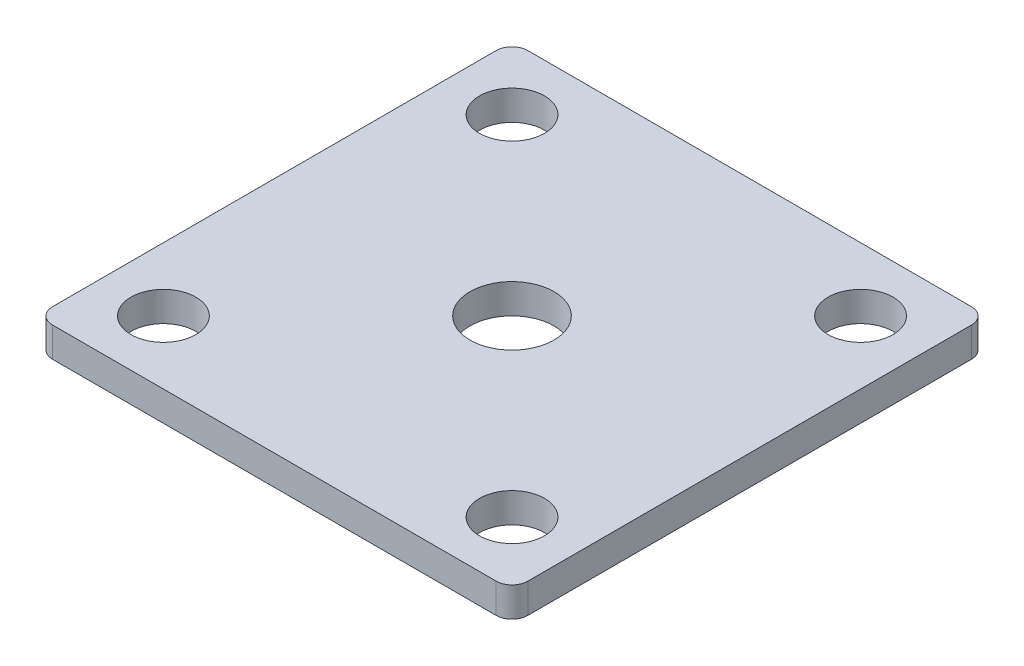
ISO-10303-21;
HEADER;
FILE_DESCRIPTION(('STEP AP214'),'2;1');
FILE_NAME('part.step','',(''),(''),'','','');
FILE_SCHEMA(('AUTOMOTIVE_DESIGN { 1 0 10303 214 1 1 1 1 }'));
ENDSEC;
DATA;
#1=APPLICATION_CONTEXT('core data for automotive mechanical design processes');
#2=APPLICATION_PROTOCOL_DEFINITION('international standard','automotive_design',2000,#1);
#3=PRODUCT_CONTEXT('',#1,'mechanical');
#4=PRODUCT('Part','Part','',(#3));
#5=PRODUCT_RELATED_PRODUCT_CATEGORY('part','',(#4));
#6=PRODUCT_DEFINITION_FORMATION('','',#4);
#7=PRODUCT_DEFINITION_CONTEXT('part definition',#1,'design');
#8=PRODUCT_DEFINITION('design','',#6,#7);
#9=PRODUCT_DEFINITION_SHAPE('','',#8);
#10=(LENGTH_UNIT() NAMED_UNIT(*) SI_UNIT(.MILLI.,.METRE.));
#11=(NAMED_UNIT(*) PLANE_ANGLE_UNIT() SI_UNIT($,.RADIAN.));
#12=(NAMED_UNIT(*) SI_UNIT($,.STERADIAN.) SOLID_ANGLE_UNIT());
#13=UNCERTAINTY_MEASURE_WITH_UNIT(LENGTH_MEASURE(1.E-05),#10,'distance_accuracy_value','');
#14=(GEOMETRIC_REPRESENTATION_CONTEXT(3) GLOBAL_UNCERTAINTY_ASSIGNED_CONTEXT((#13)) GLOBAL_UNIT_ASSIGNED_CONTEXT((#10,
#11,#12)) REPRESENTATION_CONTEXT('',''));
#15=CARTESIAN_POINT('',(0.,0.,0.));
#16=DIRECTION('',(0.,0.,1.));
#17=DIRECTION('',(1.,0.,0.));
#18=AXIS2_PLACEMENT_3D('',#15,#16,#17);
#19=CARTESIAN_POINT('',(0.,2.38125,0.));
#20=DIRECTION('',(0.,1.,0.));
#21=DIRECTION('',(0.,0.,1.));
#22=AXIS2_PLACEMENT_3D('',#19,#20,#21);
#23=PLANE('',#22);
#24=CARTESIAN_POINT('',(13.97,2.38125,-13.97));
#25=DIRECTION('',(0.,1.,0.));
#26=DIRECTION('',(0.,0.,1.));
#27=AXIS2_PLACEMENT_3D('',#24,#25,#26);
#28=CIRCLE('',#27,2.6035);
#29=CARTESIAN_POINT('',(13.97,2.38125,-16.5735));
#30=VERTEX_POINT('',#29);
#31=EDGE_CURVE('E193',#30,#30,#28,.T.);
#32=ORIENTED_EDGE('',*,*,#31,.F.);
#33=EDGE_LOOP('',(#32));
#34=FACE_BOUND('',#33,.T.);
#35=CARTESIAN_POINT('',(-13.97,2.38125,13.97));
#36=DIRECTION('',(0.,1.,0.));
#37=DIRECTION('',(0.,0.,1.));
#38=AXIS2_PLACEMENT_3D('',#35,#36,#37);
#39=CIRCLE('',#38,2.6035);
#40=CARTESIAN_POINT('',(-13.97,2.38125,11.3665));
#41=VERTEX_POINT('',#40);
#42=EDGE_CURVE('E182',#41,#41,#39,.T.);
#43=ORIENTED_EDGE('',*,*,#42,.F.);
#44=EDGE_LOOP('',(#43));
#45=FACE_BOUND('',#44,.T.);
#46=DIRECTION('',(-1.,0.,0.));
#47=VECTOR('',#46,1.);
#48=CARTESIAN_POINT('',(-19.05,2.38125,-19.05));
#49=LINE('',#48,#47);
#50=CARTESIAN_POINT('',(17.78,2.38125,-19.05));
#51=VERTEX_POINT('',#50);
#52=CARTESIAN_POINT('',(-17.78,2.38125,-19.05));
#53=VERTEX_POINT('',#52);
#54=EDGE_CURVE('E168',#51,#53,#49,.T.);
#55=ORIENTED_EDGE('',*,*,#54,.T.);
#56=CARTESIAN_POINT('',(-17.78,2.38125,-17.78));
#57=DIRECTION('',(0.,1.,0.));
#58=DIRECTION('',(0.,0.,1.));
#59=AXIS2_PLACEMENT_3D('',#56,#57,#58);
#60=CIRCLE('',#59,1.27);
#61=CARTESIAN_POINT('',(-19.05,2.38125,-17.78));
#62=VERTEX_POINT('',#61);
#63=EDGE_CURVE('E146',#53,#62,#60,.T.);
#64=ORIENTED_EDGE('',*,*,#63,.T.);
#65=DIRECTION('',(0.,0.,1.));
#66=VECTOR('',#65,1.);
#67=CARTESIAN_POINT('',(-19.05,2.38125,-19.05));
#68=LINE('',#67,#66);
#69=CARTESIAN_POINT('',(-19.05,2.38125,17.78));
#70=VERTEX_POINT('',#69);
#71=EDGE_CURVE('E116',#62,#70,#68,.T.);
#72=ORIENTED_EDGE('',*,*,#71,.T.);
#73=CARTESIAN_POINT('',(-17.78,2.38125,17.78));
#74=DIRECTION('',(0.,1.,0.));
#75=DIRECTION('',(0.,0.,1.));
#76=AXIS2_PLACEMENT_3D('',#73,#74,#75);
#77=CIRCLE('',#76,1.27);
#78=CARTESIAN_POINT('',(-17.78,2.38125,19.05));
#79=VERTEX_POINT('',#78);
#80=EDGE_CURVE('E52',#70,#79,#77,.T.);
#81=ORIENTED_EDGE('',*,*,#80,.T.);
#82=DIRECTION('',(1.,0.,0.));
#83=VECTOR('',#82,1.);
#84=CARTESIAN_POINT('',(-19.05,2.38125,19.05));
#85=LINE('',#84,#83);
#86=CARTESIAN_POINT('',(17.78,2.38125,19.05));
#87=VERTEX_POINT('',#86);
#88=EDGE_CURVE('E132',#79,#87,#85,.T.);
#89=ORIENTED_EDGE('',*,*,#88,.T.);
#90=CARTESIAN_POINT('',(17.78,2.38125,17.78));
#91=DIRECTION('',(0.,1.,0.));
#92=DIRECTION('',(0.,0.,1.));
#93=AXIS2_PLACEMENT_3D('',#90,#91,#92);
#94=CIRCLE('',#93,1.27);
#95=CARTESIAN_POINT('',(19.05,2.38125,17.78));
#96=VERTEX_POINT('',#95);
#97=EDGE_CURVE('E142',#87,#96,#94,.T.);
#98=ORIENTED_EDGE('',*,*,#97,.T.);
#99=DIRECTION('',(0.,0.,-1.));
#100=VECTOR('',#99,1.);
#101=CARTESIAN_POINT('',(19.05,2.38125,-19.05));
#102=LINE('',#101,#100);
#103=CARTESIAN_POINT('',(19.05,2.38125,-17.78));
#104=VERTEX_POINT('',#103);
#105=EDGE_CURVE('E126',#96,#104,#102,.T.);
#106=ORIENTED_EDGE('',*,*,#105,.T.);
#107=CARTESIAN_POINT('',(17.78,2.38125,-17.78));
#108=DIRECTION('',(0.,1.,0.));
#109=DIRECTION('',(0.,0.,1.));
#110=AXIS2_PLACEMENT_3D('',#107,#108,#109);
#111=CIRCLE('',#110,1.27);
#112=EDGE_CURVE('E144',#104,#51,#111,.T.);
#113=ORIENTED_EDGE('',*,*,#112,.T.);
#114=EDGE_LOOP('',(#55,#64,#72,#81,#89,#98,#106,#113));
#115=FACE_BOUND('',#114,.T.);
#116=CARTESIAN_POINT('',(-13.97,2.38125,-13.97));
#117=DIRECTION('',(0.,1.,0.));
#118=DIRECTION('',(0.,0.,1.));
#119=AXIS2_PLACEMENT_3D('',#116,#117,#118);
#120=CIRCLE('',#119,2.6035);
#121=CARTESIAN_POINT('',(-13.97,2.38125,-16.5735));
#122=VERTEX_POINT('',#121);
#123=EDGE_CURVE('E177',#122,#122,#120,.T.);
#124=ORIENTED_EDGE('',*,*,#123,.F.);
#125=EDGE_LOOP('',(#124));
#126=FACE_BOUND('',#125,.T.);
#127=CARTESIAN_POINT('',(13.97,2.38125,13.97));
#128=DIRECTION('',(0.,1.,0.));
#129=DIRECTION('',(0.,0.,1.));
#130=AXIS2_PLACEMENT_3D('',#127,#128,#129);
#131=CIRCLE('',#130,2.6035);
#132=CARTESIAN_POINT('',(13.97,2.38125,11.3665));
#133=VERTEX_POINT('',#132);
#134=EDGE_CURVE('E187',#133,#133,#131,.T.);
#135=ORIENTED_EDGE('',*,*,#134,.F.);
#136=EDGE_LOOP('',(#135));
#137=FACE_BOUND('',#136,.T.);
#138=CARTESIAN_POINT('',(0.,2.38125,0.));
#139=DIRECTION('',(0.,1.,0.));
#140=DIRECTION('',(0.,0.,1.));
#141=AXIS2_PLACEMENT_3D('',#138,#139,#140);
#142=CIRCLE('',#141,3.3655);
#143=CARTESIAN_POINT('',(0.,2.38125,-3.3655));
#144=VERTEX_POINT('',#143);
#145=EDGE_CURVE('E199',#144,#144,#142,.T.);
#146=ORIENTED_EDGE('',*,*,#145,.F.);
#147=EDGE_LOOP('',(#146));
#148=FACE_BOUND('',#147,.T.);
#149=ADVANCED_FACE('F32',(#34,#45,#115,#126,#137,#148),#23,.T.);
#150=CARTESIAN_POINT('',(0.,0.,0.));
#151=DIRECTION('',(0.,1.,0.));
#152=DIRECTION('',(0.,0.,1.));
#153=AXIS2_PLACEMENT_3D('',#150,#151,#152);
#154=PLANE('',#153);
#155=DIRECTION('',(0.,0.,1.));
#156=VECTOR('',#155,1.);
#157=CARTESIAN_POINT('',(-19.05,0.,-19.05));
#158=LINE('',#157,#156);
#159=CARTESIAN_POINT('',(-19.05,0.,-17.78));
#160=VERTEX_POINT('',#159);
#161=CARTESIAN_POINT('',(-19.05,0.,17.78));
#162=VERTEX_POINT('',#161);
#163=EDGE_CURVE('E114',#160,#162,#158,.T.);
#164=ORIENTED_EDGE('',*,*,#163,.F.);
#165=CARTESIAN_POINT('',(-17.78,0.,-17.78));
#166=DIRECTION('',(0.,1.,0.));
#167=DIRECTION('',(0.,0.,1.));
#168=AXIS2_PLACEMENT_3D('',#165,#166,#167);
#169=CIRCLE('',#168,1.27);
#170=CARTESIAN_POINT('',(-17.78,0.,-19.05));
#171=VERTEX_POINT('',#170);
#172=EDGE_CURVE('E97',#160,#171,#169,.F.);
#173=ORIENTED_EDGE('',*,*,#172,.T.);
#174=DIRECTION('',(-1.,0.,0.));
#175=VECTOR('',#174,1.);
#176=CARTESIAN_POINT('',(-19.05,0.,-19.05));
#177=LINE('',#176,#175);
#178=CARTESIAN_POINT('',(17.78,0.,-19.05));
#179=VERTEX_POINT('',#178);
#180=EDGE_CURVE('E124',#179,#171,#177,.T.);
#181=ORIENTED_EDGE('',*,*,#180,.F.);
#182=CARTESIAN_POINT('',(17.78,0.,-17.78));
#183=DIRECTION('',(0.,1.,0.));
#184=DIRECTION('',(0.,0.,1.));
#185=AXIS2_PLACEMENT_3D('',#182,#183,#184);
#186=CIRCLE('',#185,1.27);
#187=CARTESIAN_POINT('',(19.05,0.,-17.78));
#188=VERTEX_POINT('',#187);
#189=EDGE_CURVE('E108',#179,#188,#186,.F.);
#190=ORIENTED_EDGE('',*,*,#189,.T.);
#191=DIRECTION('',(0.,0.,-1.));
#192=VECTOR('',#191,1.);
#193=CARTESIAN_POINT('',(19.05,0.,-19.05));
#194=LINE('',#193,#192);
#195=CARTESIAN_POINT('',(19.05,0.,17.78));
#196=VERTEX_POINT('',#195);
#197=EDGE_CURVE('E128',#196,#188,#194,.T.);
#198=ORIENTED_EDGE('',*,*,#197,.F.);
#199=CARTESIAN_POINT('',(17.78,0.,17.78));
#200=DIRECTION('',(0.,1.,0.));
#201=DIRECTION('',(0.,0.,1.));
#202=AXIS2_PLACEMENT_3D('',#199,#200,#201);
#203=CIRCLE('',#202,1.27);
#204=CARTESIAN_POINT('',(17.78,0.,19.05));
#205=VERTEX_POINT('',#204);
#206=EDGE_CURVE('E135',#196,#205,#203,.F.);
#207=ORIENTED_EDGE('',*,*,#206,.T.);
#208=DIRECTION('',(1.,0.,0.));
#209=VECTOR('',#208,1.);
#210=CARTESIAN_POINT('',(-19.05,0.,19.05));
#211=LINE('',#210,#209);
#212=CARTESIAN_POINT('',(-17.78,0.,19.05));
#213=VERTEX_POINT('',#212);
#214=EDGE_CURVE('E123',#213,#205,#211,.T.);
#215=ORIENTED_EDGE('',*,*,#214,.F.);
#216=CARTESIAN_POINT('',(-17.78,0.,17.78));
#217=DIRECTION('',(0.,1.,0.));
#218=DIRECTION('',(0.,0.,1.));
#219=AXIS2_PLACEMENT_3D('',#216,#217,#218);
#220=CIRCLE('',#219,1.27);
#221=EDGE_CURVE('E117',#213,#162,#220,.F.);
#222=ORIENTED_EDGE('',*,*,#221,.T.);
#223=EDGE_LOOP('',(#164,#173,#181,#190,#198,#207,#215,#222));
#224=FACE_BOUND('',#223,.T.);
#225=CARTESIAN_POINT('',(-13.97,0.,-13.97));
#226=DIRECTION('',(0.,1.,0.));
#227=DIRECTION('',(0.,0.,1.));
#228=AXIS2_PLACEMENT_3D('',#225,#226,#227);
#229=CIRCLE('',#228,2.6035);
#230=CARTESIAN_POINT('',(-13.97,0.,-16.5735));
#231=VERTEX_POINT('',#230);
#232=EDGE_CURVE('E173',#231,#231,#229,.T.);
#233=ORIENTED_EDGE('',*,*,#232,.T.);
#234=EDGE_LOOP('',(#233));
#235=FACE_BOUND('',#234,.T.);
#236=CARTESIAN_POINT('',(-13.97,0.,13.97));
#237=DIRECTION('',(0.,1.,0.));
#238=DIRECTION('',(0.,0.,1.));
#239=AXIS2_PLACEMENT_3D('',#236,#237,#238);
#240=CIRCLE('',#239,2.6035);
#241=CARTESIAN_POINT('',(-13.97,0.,11.3665));
#242=VERTEX_POINT('',#241);
#243=EDGE_CURVE('E184',#242,#242,#240,.T.);
#244=ORIENTED_EDGE('',*,*,#243,.T.);
#245=EDGE_LOOP('',(#244));
#246=FACE_BOUND('',#245,.T.);
#247=CARTESIAN_POINT('',(13.97,0.,13.97));
#248=DIRECTION('',(0.,1.,0.));
#249=DIRECTION('',(0.,0.,1.));
#250=AXIS2_PLACEMENT_3D('',#247,#248,#249);
#251=CIRCLE('',#250,2.6035);
#252=CARTESIAN_POINT('',(13.97,0.,11.3665));
#253=VERTEX_POINT('',#252);
#254=EDGE_CURVE('E190',#253,#253,#251,.T.);
#255=ORIENTED_EDGE('',*,*,#254,.T.);
#256=EDGE_LOOP('',(#255));
#257=FACE_BOUND('',#256,.T.);
#258=CARTESIAN_POINT('',(13.97,0.,-13.97));
#259=DIRECTION('',(0.,1.,0.));
#260=DIRECTION('',(0.,0.,1.));
#261=AXIS2_PLACEMENT_3D('',#258,#259,#260);
#262=CIRCLE('',#261,2.6035);
#263=CARTESIAN_POINT('',(13.97,0.,-16.5735));
#264=VERTEX_POINT('',#263);
#265=EDGE_CURVE('E196',#264,#264,#262,.T.);
#266=ORIENTED_EDGE('',*,*,#265,.T.);
#267=EDGE_LOOP('',(#266));
#268=FACE_BOUND('',#267,.T.);
#269=CARTESIAN_POINT('',(0.,0.,0.));
#270=DIRECTION('',(0.,1.,0.));
#271=DIRECTION('',(0.,0.,1.));
#272=AXIS2_PLACEMENT_3D('',#269,#270,#271);
#273=CIRCLE('',#272,3.3655);
#274=CARTESIAN_POINT('',(0.,0.,-3.3655));
#275=VERTEX_POINT('',#274);
#276=EDGE_CURVE('E202',#275,#275,#273,.T.);
#277=ORIENTED_EDGE('',*,*,#276,.T.);
#278=EDGE_LOOP('',(#277));
#279=FACE_BOUND('',#278,.T.);
#280=ADVANCED_FACE('F120',(#224,#235,#246,#257,#268,#279),#154,.F.);
#281=CARTESIAN_POINT('',(19.05,2.38125,-19.05));
#282=DIRECTION('',(-1.,0.,0.));
#283=DIRECTION('',(0.,0.,1.));
#284=AXIS2_PLACEMENT_3D('',#281,#282,#283);
#285=PLANE('',#284);
#286=ORIENTED_EDGE('',*,*,#197,.T.);
#287=DIRECTION('',(0.,-1.,0.));
#288=VECTOR('',#287,1.);
#289=CARTESIAN_POINT('',(19.05,2.38125,-17.78));
#290=LINE('',#289,#288);
#291=EDGE_CURVE('E151',#188,#104,#290,.F.);
#292=ORIENTED_EDGE('',*,*,#291,.T.);
#293=ORIENTED_EDGE('',*,*,#105,.F.);
#294=DIRECTION('',(0.,-1.,0.));
#295=VECTOR('',#294,1.);
#296=CARTESIAN_POINT('',(19.05,2.38125,17.78));
#297=LINE('',#296,#295);
#298=EDGE_CURVE('E148',#96,#196,#297,.T.);
#299=ORIENTED_EDGE('',*,*,#298,.T.);
#300=EDGE_LOOP('',(#286,#292,#293,#299));
#301=FACE_BOUND('',#300,.T.);
#302=ADVANCED_FACE('F164',(#301),#285,.F.);
#303=CARTESIAN_POINT('',(-19.05,2.38125,-19.05));
#304=DIRECTION('',(0.,0.,1.));
#305=DIRECTION('',(1.,0.,0.));
#306=AXIS2_PLACEMENT_3D('',#303,#304,#305);
#307=PLANE('',#306);
#308=ORIENTED_EDGE('',*,*,#180,.T.);
#309=DIRECTION('',(0.,-1.,0.));
#310=VECTOR('',#309,1.);
#311=CARTESIAN_POINT('',(-17.78,2.38125,-19.05));
#312=LINE('',#311,#310);
#313=EDGE_CURVE('E102',#171,#53,#312,.F.);
#314=ORIENTED_EDGE('',*,*,#313,.T.);
#315=ORIENTED_EDGE('',*,*,#54,.F.);
#316=DIRECTION('',(0.,-1.,0.));
#317=VECTOR('',#316,1.);
#318=CARTESIAN_POINT('',(17.78,2.38125,-19.05));
#319=LINE('',#318,#317);
#320=EDGE_CURVE('E107',#51,#179,#319,.T.);
#321=ORIENTED_EDGE('',*,*,#320,.T.);
#322=EDGE_LOOP('',(#308,#314,#315,#321));
#323=FACE_BOUND('',#322,.T.);
#324=ADVANCED_FACE('F228',(#323),#307,.F.);
#325=CARTESIAN_POINT('',(-19.05,2.38125,-19.05));
#326=DIRECTION('',(1.,0.,0.));
#327=DIRECTION('',(0.,0.,-1.));
#328=AXIS2_PLACEMENT_3D('',#325,#326,#327);
#329=PLANE('',#328);
#330=ORIENTED_EDGE('',*,*,#71,.F.);
#331=DIRECTION('',(0.,-1.,0.));
#332=VECTOR('',#331,1.);
#333=CARTESIAN_POINT('',(-19.05,2.38125,-17.78));
#334=LINE('',#333,#332);
#335=EDGE_CURVE('E101',#62,#160,#334,.T.);
#336=ORIENTED_EDGE('',*,*,#335,.T.);
#337=ORIENTED_EDGE('',*,*,#163,.T.);
#338=DIRECTION('',(0.,-1.,0.));
#339=VECTOR('',#338,1.);
#340=CARTESIAN_POINT('',(-19.05,2.38125,17.78));
#341=LINE('',#340,#339);
#342=EDGE_CURVE('E118',#162,#70,#341,.F.);
#343=ORIENTED_EDGE('',*,*,#342,.T.);
#344=EDGE_LOOP('',(#330,#336,#337,#343));
#345=FACE_BOUND('',#344,.T.);
#346=ADVANCED_FACE('F113',(#345),#329,.F.);
#347=CARTESIAN_POINT('',(-19.05,2.38125,19.05));
#348=DIRECTION('',(0.,0.,-1.));
#349=DIRECTION('',(-1.,0.,0.));
#350=AXIS2_PLACEMENT_3D('',#347,#348,#349);
#351=PLANE('',#350);
#352=ORIENTED_EDGE('',*,*,#214,.T.);
#353=DIRECTION('',(0.,-1.,0.));
#354=VECTOR('',#353,1.);
#355=CARTESIAN_POINT('',(17.78,2.38125,19.05));
#356=LINE('',#355,#354);
#357=EDGE_CURVE('E11',#205,#87,#356,.F.);
#358=ORIENTED_EDGE('',*,*,#357,.T.);
#359=ORIENTED_EDGE('',*,*,#88,.F.);
#360=DIRECTION('',(0.,-1.,0.));
#361=VECTOR('',#360,1.);
#362=CARTESIAN_POINT('',(-17.78,2.38125,19.05));
#363=LINE('',#362,#361);
#364=EDGE_CURVE('E40',#79,#213,#363,.T.);
#365=ORIENTED_EDGE('',*,*,#364,.T.);
#366=EDGE_LOOP('',(#352,#358,#359,#365));
#367=FACE_BOUND('',#366,.T.);
#368=ADVANCED_FACE('F154',(#367),#351,.F.);
#369=CARTESIAN_POINT('',(-13.97,2.38125,-13.97));
#370=DIRECTION('',(0.,-1.,0.));
#371=DIRECTION('',(0.,0.,-1.));
#372=AXIS2_PLACEMENT_3D('',#369,#370,#371);
#373=CYLINDRICAL_SURFACE('',#372,2.6035);
#374=CARTESIAN_POINT('',(-13.97,2.38125,-16.5735));
#375=CARTESIAN_POINT('',(-13.97,2.3564453125,-16.5735));
#376=CARTESIAN_POINT('',(-13.97,2.331640625,-16.5735));
#377=CARTESIAN_POINT('',(-13.97,2.28203125,-16.5735));
#378=CARTESIAN_POINT('',(-13.97,2.2572265625,-16.5735));
#379=CARTESIAN_POINT('',(-13.97,2.2076171875,-16.5735));
#380=CARTESIAN_POINT('',(-13.97,2.1828125,-16.5735));
#381=CARTESIAN_POINT('',(-13.97,2.133203125,-16.5735));
#382=CARTESIAN_POINT('',(-13.97,2.1083984375,-16.5735));
#383=CARTESIAN_POINT('',(-13.97,2.0587890625,-16.5735));
#384=CARTESIAN_POINT('',(-13.97,2.033984375,-16.5735));
#385=CARTESIAN_POINT('',(-13.97,1.984375,-16.5735));
#386=CARTESIAN_POINT('',(-13.97,1.9595703125,-16.5735));
#387=CARTESIAN_POINT('',(-13.97,1.9099609375,-16.5735));
#388=CARTESIAN_POINT('',(-13.97,1.88515625,-16.5735));
#389=CARTESIAN_POINT('',(-13.97,1.835546875,-16.5735));
#390=CARTESIAN_POINT('',(-13.97,1.8107421875,-16.5735));
#391=CARTESIAN_POINT('',(-13.97,1.7611328125,-16.5735));
#392=CARTESIAN_POINT('',(-13.97,1.736328125,-16.5735));
#393=CARTESIAN_POINT('',(-13.97,1.68671875,-16.5735));
#394=CARTESIAN_POINT('',(-13.97,1.6619140625,-16.5735));
#395=CARTESIAN_POINT('',(-13.97,1.6123046875,-16.5735));
#396=CARTESIAN_POINT('',(-13.97,1.5875,-16.5735));
#397=CARTESIAN_POINT('',(-13.97,1.537890625,-16.5735));
#398=CARTESIAN_POINT('',(-13.97,1.5130859375,-16.5735));
#399=CARTESIAN_POINT('',(-13.97,1.4634765625,-16.5735));
#400=CARTESIAN_POINT('',(-13.97,1.438671875,-16.5735));
#401=CARTESIAN_POINT('',(-13.97,1.3890625,-16.5735));
#402=CARTESIAN_POINT('',(-13.97,1.3642578125,-16.5735));
#403=CARTESIAN_POINT('',(-13.97,1.3146484375,-16.5735));
#404=CARTESIAN_POINT('',(-13.97,1.28984375,-16.5735));
#405=CARTESIAN_POINT('',(-13.97,1.240234375,-16.5735));
#406=CARTESIAN_POINT('',(-13.97,1.2154296875,-16.5735));
#407=CARTESIAN_POINT('',(-13.97,1.1658203125,-16.5735));
#408=CARTESIAN_POINT('',(-13.97,1.141015625,-16.5735));
#409=CARTESIAN_POINT('',(-13.97,1.09140625,-16.5735));
#410=CARTESIAN_POINT('',(-13.97,1.0666015625,-16.5735));
#411=CARTESIAN_POINT('',(-13.97,1.0169921875,-16.5735));
#412=CARTESIAN_POINT('',(-13.97,0.9921875,-16.5735));
#413=CARTESIAN_POINT('',(-13.97,0.942578125,-16.5735));
#414=CARTESIAN_POINT('',(-13.97,0.9177734375,-16.5735));
#415=CARTESIAN_POINT('',(-13.97,0.8681640625,-16.5735));
#416=CARTESIAN_POINT('',(-13.97,0.843359375,-16.5735));
#417=CARTESIAN_POINT('',(-13.97,0.79375,-16.5735));
#418=CARTESIAN_POINT('',(-13.97,0.7689453125,-16.5735));
#419=CARTESIAN_POINT('',(-13.97,0.7193359375,-16.5735));
#420=CARTESIAN_POINT('',(-13.97,0.69453125,-16.5735));
#421=CARTESIAN_POINT('',(-13.97,0.644921875,-16.5735));
#422=CARTESIAN_POINT('',(-13.97,0.6201171875,-16.5735));
#423=CARTESIAN_POINT('',(-13.97,0.5705078125,-16.5735));
#424=CARTESIAN_POINT('',(-13.97,0.545703125,-16.5735));
#425=CARTESIAN_POINT('',(-13.97,0.49609375,-16.5735));
#426=CARTESIAN_POINT('',(-13.97,0.4712890625,-16.5735));
#427=CARTESIAN_POINT('',(-13.97,0.4216796875,-16.5735));
#428=CARTESIAN_POINT('',(-13.97,0.396875,-16.5735));
#429=CARTESIAN_POINT('',(-13.97,0.347265625,-16.5735));
#430=CARTESIAN_POINT('',(-13.97,0.3224609375,-16.5735));
#431=CARTESIAN_POINT('',(-13.97,0.2728515625,-16.5735));
#432=CARTESIAN_POINT('',(-13.97,0.248046875,-16.5735));
#433=CARTESIAN_POINT('',(-13.97,0.1984375,-16.5735));
#434=CARTESIAN_POINT('',(-13.97,0.1736328125,-16.5735));
#435=CARTESIAN_POINT('',(-13.97,0.1240234375,-16.5735));
#436=CARTESIAN_POINT('',(-13.97,0.0992187500000001,-16.5735));
#437=CARTESIAN_POINT('',(-13.97,0.049609375,-16.5735));
#438=CARTESIAN_POINT('',(-13.97,0.0248046875,-16.5735));
#439=CARTESIAN_POINT('',(-13.97,0.,-16.5735));
#440=B_SPLINE_CURVE_WITH_KNOTS('',3,(#374,#375,#376,#377,#378,#379,#380,#381,#382,#383,#384,
#385,#386,#387,#388,#389,#390,#391,#392,#393,#394,#395,#396,#397,#398,#399,#400,#401,#402,#403,
#404,#405,#406,#407,#408,#409,#410,#411,#412,#413,#414,#415,#416,#417,#418,#419,#420,#421,#422,
#423,#424,#425,#426,#427,#428,#429,#430,#431,#432,#433,#434,#435,#436,#437,#438,#439),
.UNSPECIFIED.,.F.,.F.,(4,2,2,2,2,2,2,2,2,2,2,2,2,2,2,2,2,2,2,2,2,2,2,2,2,2,2,2,2,2,2,2,4),(0.,
0.0744140624999996,0.148828125,0.2232421875,0.29765625,0.3720703125,0.446484375,0.5208984375,
0.5953125,0.6697265625,0.744140625,0.8185546875,0.89296875,0.9673828125,1.041796875,
1.1162109375,1.190625,1.2650390625,1.339453125,1.4138671875,1.48828125,1.5626953125,1.637109375,
1.7115234375,1.7859375,1.8603515625,1.934765625,2.0091796875,2.08359375,2.1580078125,
2.232421875,2.3068359375,2.38125),.UNSPECIFIED.);
#441=EDGE_CURVE('BSEAM221',#122,#231,#440,.T.);
#442=ORIENTED_EDGE('',*,*,#123,.T.);
#443=ORIENTED_EDGE('',*,*,#232,.F.);
#444=ORIENTED_EDGE('',*,*,#441,.T.);
#445=ORIENTED_EDGE('',*,*,#441,.F.);
#446=EDGE_LOOP('',(#442,#444,#443,#445));
#447=FACE_BOUND('',#446,.T.);
#448=ADVANCED_FACE('F221',(#447),#373,.F.);
#449=CARTESIAN_POINT('',(-13.97,2.38125,13.97));
#450=DIRECTION('',(0.,-1.,0.));
#451=DIRECTION('',(0.,0.,-1.));
#452=AXIS2_PLACEMENT_3D('',#449,#450,#451);
#453=CYLINDRICAL_SURFACE('',#452,2.6035);
#454=CARTESIAN_POINT('',(-13.97,2.38125,11.3665));
#455=CARTESIAN_POINT('',(-13.97,2.3564453125,11.3665));
#456=CARTESIAN_POINT('',(-13.97,2.331640625,11.3665));
#457=CARTESIAN_POINT('',(-13.97,2.28203125,11.3665));
#458=CARTESIAN_POINT('',(-13.97,2.2572265625,11.3665));
#459=CARTESIAN_POINT('',(-13.97,2.2076171875,11.3665));
#460=CARTESIAN_POINT('',(-13.97,2.1828125,11.3665));
#461=CARTESIAN_POINT('',(-13.97,2.133203125,11.3665));
#462=CARTESIAN_POINT('',(-13.97,2.1083984375,11.3665));
#463=CARTESIAN_POINT('',(-13.97,2.0587890625,11.3665));
#464=CARTESIAN_POINT('',(-13.97,2.033984375,11.3665));
#465=CARTESIAN_POINT('',(-13.97,1.984375,11.3665));
#466=CARTESIAN_POINT('',(-13.97,1.9595703125,11.3665));
#467=CARTESIAN_POINT('',(-13.97,1.9099609375,11.3665));
#468=CARTESIAN_POINT('',(-13.97,1.88515625,11.3665));
#469=CARTESIAN_POINT('',(-13.97,1.835546875,11.3665));
#470=CARTESIAN_POINT('',(-13.97,1.8107421875,11.3665));
#471=CARTESIAN_POINT('',(-13.97,1.7611328125,11.3665));
#472=CARTESIAN_POINT('',(-13.97,1.736328125,11.3665));
#473=CARTESIAN_POINT('',(-13.97,1.68671875,11.3665));
#474=CARTESIAN_POINT('',(-13.97,1.6619140625,11.3665));
#475=CARTESIAN_POINT('',(-13.97,1.6123046875,11.3665));
#476=CARTESIAN_POINT('',(-13.97,1.5875,11.3665));
#477=CARTESIAN_POINT('',(-13.97,1.537890625,11.3665));
#478=CARTESIAN_POINT('',(-13.97,1.5130859375,11.3665));
#479=CARTESIAN_POINT('',(-13.97,1.4634765625,11.3665));
#480=CARTESIAN_POINT('',(-13.97,1.438671875,11.3665));
#481=CARTESIAN_POINT('',(-13.97,1.3890625,11.3665));
#482=CARTESIAN_POINT('',(-13.97,1.3642578125,11.3665));
#483=CARTESIAN_POINT('',(-13.97,1.3146484375,11.3665));
#484=CARTESIAN_POINT('',(-13.97,1.28984375,11.3665));
#485=CARTESIAN_POINT('',(-13.97,1.240234375,11.3665));
#486=CARTESIAN_POINT('',(-13.97,1.2154296875,11.3665));
#487=CARTESIAN_POINT('',(-13.97,1.1658203125,11.3665));
#488=CARTESIAN_POINT('',(-13.97,1.141015625,11.3665));
#489=CARTESIAN_POINT('',(-13.97,1.09140625,11.3665));
#490=CARTESIAN_POINT('',(-13.97,1.0666015625,11.3665));
#491=CARTESIAN_POINT('',(-13.97,1.0169921875,11.3665));
#492=CARTESIAN_POINT('',(-13.97,0.9921875,11.3665));
#493=CARTESIAN_POINT('',(-13.97,0.942578125,11.3665));
#494=CARTESIAN_POINT('',(-13.97,0.9177734375,11.3665));
#495=CARTESIAN_POINT('',(-13.97,0.8681640625,11.3665));
#496=CARTESIAN_POINT('',(-13.97,0.843359375,11.3665));
#497=CARTESIAN_POINT('',(-13.97,0.79375,11.3665));
#498=CARTESIAN_POINT('',(-13.97,0.7689453125,11.3665));
#499=CARTESIAN_POINT('',(-13.97,0.7193359375,11.3665));
#500=CARTESIAN_POINT('',(-13.97,0.69453125,11.3665));
#501=CARTESIAN_POINT('',(-13.97,0.644921875,11.3665));
#502=CARTESIAN_POINT('',(-13.97,0.6201171875,11.3665));
#503=CARTESIAN_POINT('',(-13.97,0.5705078125,11.3665));
#504=CARTESIAN_POINT('',(-13.97,0.545703125,11.3665));
#505=CARTESIAN_POINT('',(-13.97,0.49609375,11.3665));
#506=CARTESIAN_POINT('',(-13.97,0.4712890625,11.3665));
#507=CARTESIAN_POINT('',(-13.97,0.4216796875,11.3665));
#508=CARTESIAN_POINT('',(-13.97,0.396875,11.3665));
#509=CARTESIAN_POINT('',(-13.97,0.347265625,11.3665));
#510=CARTESIAN_POINT('',(-13.97,0.3224609375,11.3665));
#511=CARTESIAN_POINT('',(-13.97,0.2728515625,11.3665));
#512=CARTESIAN_POINT('',(-13.97,0.248046875,11.3665));
#513=CARTESIAN_POINT('',(-13.97,0.1984375,11.3665));
#514=CARTESIAN_POINT('',(-13.97,0.1736328125,11.3665));
#515=CARTESIAN_POINT('',(-13.97,0.1240234375,11.3665));
#516=CARTESIAN_POINT('',(-13.97,0.0992187500000001,11.3665));
#517=CARTESIAN_POINT('',(-13.97,0.049609375,11.3665));
#518=CARTESIAN_POINT('',(-13.97,0.0248046875,11.3665));
#519=CARTESIAN_POINT('',(-13.97,0.,11.3665));
#520=B_SPLINE_CURVE_WITH_KNOTS('',3,(#454,#455,#456,#457,#458,#459,#460,#461,#462,#463,#464,
#465,#466,#467,#468,#469,#470,#471,#472,#473,#474,#475,#476,#477,#478,#479,#480,#481,#482,#483,
#484,#485,#486,#487,#488,#489,#490,#491,#492,#493,#494,#495,#496,#497,#498,#499,#500,#501,#502,
#503,#504,#505,#506,#507,#508,#509,#510,#511,#512,#513,#514,#515,#516,#517,#518,#519),
.UNSPECIFIED.,.F.,.F.,(4,2,2,2,2,2,2,2,2,2,2,2,2,2,2,2,2,2,2,2,2,2,2,2,2,2,2,2,2,2,2,2,4),(0.,
0.0744140624999996,0.148828125,0.2232421875,0.29765625,0.3720703125,0.446484375,0.5208984375,
0.5953125,0.6697265625,0.744140625,0.8185546875,0.89296875,0.9673828125,1.041796875,
1.1162109375,1.190625,1.2650390625,1.339453125,1.4138671875,1.48828125,1.5626953125,1.637109375,
1.7115234375,1.7859375,1.8603515625,1.934765625,2.0091796875,2.08359375,2.1580078125,
2.232421875,2.3068359375,2.38125),.UNSPECIFIED.);
#521=EDGE_CURVE('BSEAM255',#41,#242,#520,.T.);
#522=ORIENTED_EDGE('',*,*,#42,.T.);
#523=ORIENTED_EDGE('',*,*,#243,.F.);
#524=ORIENTED_EDGE('',*,*,#521,.T.);
#525=ORIENTED_EDGE('',*,*,#521,.F.);
#526=EDGE_LOOP('',(#522,#524,#523,#525));
#527=FACE_BOUND('',#526,.T.);
#528=ADVANCED_FACE('F255',(#527),#453,.F.);
#529=CARTESIAN_POINT('',(13.97,2.38125,13.97));
#530=DIRECTION('',(0.,-1.,0.));
#531=DIRECTION('',(0.,0.,-1.));
#532=AXIS2_PLACEMENT_3D('',#529,#530,#531);
#533=CYLINDRICAL_SURFACE('',#532,2.6035);
#534=CARTESIAN_POINT('',(13.97,2.38125,11.3665));
#535=CARTESIAN_POINT('',(13.97,2.3564453125,11.3665));
#536=CARTESIAN_POINT('',(13.97,2.331640625,11.3665));
#537=CARTESIAN_POINT('',(13.97,2.28203125,11.3665));
#538=CARTESIAN_POINT('',(13.97,2.2572265625,11.3665));
#539=CARTESIAN_POINT('',(13.97,2.2076171875,11.3665));
#540=CARTESIAN_POINT('',(13.97,2.1828125,11.3665));
#541=CARTESIAN_POINT('',(13.97,2.133203125,11.3665));
#542=CARTESIAN_POINT('',(13.97,2.1083984375,11.3665));
#543=CARTESIAN_POINT('',(13.97,2.0587890625,11.3665));
#544=CARTESIAN_POINT('',(13.97,2.033984375,11.3665));
#545=CARTESIAN_POINT('',(13.97,1.984375,11.3665));
#546=CARTESIAN_POINT('',(13.97,1.9595703125,11.3665));
#547=CARTESIAN_POINT('',(13.97,1.9099609375,11.3665));
#548=CARTESIAN_POINT('',(13.97,1.88515625,11.3665));
#549=CARTESIAN_POINT('',(13.97,1.835546875,11.3665));
#550=CARTESIAN_POINT('',(13.97,1.8107421875,11.3665));
#551=CARTESIAN_POINT('',(13.97,1.7611328125,11.3665));
#552=CARTESIAN_POINT('',(13.97,1.736328125,11.3665));
#553=CARTESIAN_POINT('',(13.97,1.68671875,11.3665));
#554=CARTESIAN_POINT('',(13.97,1.6619140625,11.3665));
#555=CARTESIAN_POINT('',(13.97,1.6123046875,11.3665));
#556=CARTESIAN_POINT('',(13.97,1.5875,11.3665));
#557=CARTESIAN_POINT('',(13.97,1.537890625,11.3665));
#558=CARTESIAN_POINT('',(13.97,1.5130859375,11.3665));
#559=CARTESIAN_POINT('',(13.97,1.4634765625,11.3665));
#560=CARTESIAN_POINT('',(13.97,1.438671875,11.3665));
#561=CARTESIAN_POINT('',(13.97,1.3890625,11.3665));
#562=CARTESIAN_POINT('',(13.97,1.3642578125,11.3665));
#563=CARTESIAN_POINT('',(13.97,1.3146484375,11.3665));
#564=CARTESIAN_POINT('',(13.97,1.28984375,11.3665));
#565=CARTESIAN_POINT('',(13.97,1.240234375,11.3665));
#566=CARTESIAN_POINT('',(13.97,1.2154296875,11.3665));
#567=CARTESIAN_POINT('',(13.97,1.1658203125,11.3665));
#568=CARTESIAN_POINT('',(13.97,1.141015625,11.3665));
#569=CARTESIAN_POINT('',(13.97,1.09140625,11.3665));
#570=CARTESIAN_POINT('',(13.97,1.0666015625,11.3665));
#571=CARTESIAN_POINT('',(13.97,1.0169921875,11.3665));
#572=CARTESIAN_POINT('',(13.97,0.9921875,11.3665));
#573=CARTESIAN_POINT('',(13.97,0.942578125,11.3665));
#574=CARTESIAN_POINT('',(13.97,0.9177734375,11.3665));
#575=CARTESIAN_POINT('',(13.97,0.8681640625,11.3665));
#576=CARTESIAN_POINT('',(13.97,0.843359375,11.3665));
#577=CARTESIAN_POINT('',(13.97,0.79375,11.3665));
#578=CARTESIAN_POINT('',(13.97,0.7689453125,11.3665));
#579=CARTESIAN_POINT('',(13.97,0.7193359375,11.3665));
#580=CARTESIAN_POINT('',(13.97,0.69453125,11.3665));
#581=CARTESIAN_POINT('',(13.97,0.644921875,11.3665));
#582=CARTESIAN_POINT('',(13.97,0.6201171875,11.3665));
#583=CARTESIAN_POINT('',(13.97,0.5705078125,11.3665));
#584=CARTESIAN_POINT('',(13.97,0.545703125,11.3665));
#585=CARTESIAN_POINT('',(13.97,0.49609375,11.3665));
#586=CARTESIAN_POINT('',(13.97,0.4712890625,11.3665));
#587=CARTESIAN_POINT('',(13.97,0.4216796875,11.3665));
#588=CARTESIAN_POINT('',(13.97,0.396875,11.3665));
#589=CARTESIAN_POINT('',(13.97,0.347265625,11.3665));
#590=CARTESIAN_POINT('',(13.97,0.3224609375,11.3665));
#591=CARTESIAN_POINT('',(13.97,0.2728515625,11.3665));
#592=CARTESIAN_POINT('',(13.97,0.248046875,11.3665));
#593=CARTESIAN_POINT('',(13.97,0.1984375,11.3665));
#594=CARTESIAN_POINT('',(13.97,0.1736328125,11.3665));
#595=CARTESIAN_POINT('',(13.97,0.1240234375,11.3665));
#596=CARTESIAN_POINT('',(13.97,0.0992187500000001,11.3665));
#597=CARTESIAN_POINT('',(13.97,0.049609375,11.3665));
#598=CARTESIAN_POINT('',(13.97,0.0248046875,11.3665));
#599=CARTESIAN_POINT('',(13.97,0.,11.3665));
#600=B_SPLINE_CURVE_WITH_KNOTS('',3,(#534,#535,#536,#537,#538,#539,#540,#541,#542,#543,#544,
#545,#546,#547,#548,#549,#550,#551,#552,#553,#554,#555,#556,#557,#558,#559,#560,#561,#562,#563,
#564,#565,#566,#567,#568,#569,#570,#571,#572,#573,#574,#575,#576,#577,#578,#579,#580,#581,#582,
#583,#584,#585,#586,#587,#588,#589,#590,#591,#592,#593,#594,#595,#596,#597,#598,#599),
.UNSPECIFIED.,.F.,.F.,(4,2,2,2,2,2,2,2,2,2,2,2,2,2,2,2,2,2,2,2,2,2,2,2,2,2,2,2,2,2,2,2,4),(0.,
0.0744140624999996,0.148828125,0.2232421875,0.29765625,0.3720703125,0.446484375,0.5208984375,
0.5953125,0.6697265625,0.744140625,0.8185546875,0.89296875,0.9673828125,1.041796875,
1.1162109375,1.190625,1.2650390625,1.339453125,1.4138671875,1.48828125,1.5626953125,1.637109375,
1.7115234375,1.7859375,1.8603515625,1.934765625,2.0091796875,2.08359375,2.1580078125,
2.232421875,2.3068359375,2.38125),.UNSPECIFIED.);
#601=EDGE_CURVE('BSEAM251',#133,#253,#600,.T.);
#602=ORIENTED_EDGE('',*,*,#134,.T.);
#603=ORIENTED_EDGE('',*,*,#254,.F.);
#604=ORIENTED_EDGE('',*,*,#601,.T.);
#605=ORIENTED_EDGE('',*,*,#601,.F.);
#606=EDGE_LOOP('',(#602,#604,#603,#605));
#607=FACE_BOUND('',#606,.T.);
#608=ADVANCED_FACE('F251',(#607),#533,.F.);
#609=CARTESIAN_POINT('',(13.97,2.38125,-13.97));
#610=DIRECTION('',(0.,-1.,0.));
#611=DIRECTION('',(0.,0.,-1.));
#612=AXIS2_PLACEMENT_3D('',#609,#610,#611);
#613=CYLINDRICAL_SURFACE('',#612,2.6035);
#614=CARTESIAN_POINT('',(13.97,2.38125,-16.5735));
#615=CARTESIAN_POINT('',(13.97,2.3564453125,-16.5735));
#616=CARTESIAN_POINT('',(13.97,2.331640625,-16.5735));
#617=CARTESIAN_POINT('',(13.97,2.28203125,-16.5735));
#618=CARTESIAN_POINT('',(13.97,2.2572265625,-16.5735));
#619=CARTESIAN_POINT('',(13.97,2.2076171875,-16.5735));
#620=CARTESIAN_POINT('',(13.97,2.1828125,-16.5735));
#621=CARTESIAN_POINT('',(13.97,2.133203125,-16.5735));
#622=CARTESIAN_POINT('',(13.97,2.1083984375,-16.5735));
#623=CARTESIAN_POINT('',(13.97,2.0587890625,-16.5735));
#624=CARTESIAN_POINT('',(13.97,2.033984375,-16.5735));
#625=CARTESIAN_POINT('',(13.97,1.984375,-16.5735));
#626=CARTESIAN_POINT('',(13.97,1.9595703125,-16.5735));
#627=CARTESIAN_POINT('',(13.97,1.9099609375,-16.5735));
#628=CARTESIAN_POINT('',(13.97,1.88515625,-16.5735));
#629=CARTESIAN_POINT('',(13.97,1.835546875,-16.5735));
#630=CARTESIAN_POINT('',(13.97,1.8107421875,-16.5735));
#631=CARTESIAN_POINT('',(13.97,1.7611328125,-16.5735));
#632=CARTESIAN_POINT('',(13.97,1.736328125,-16.5735));
#633=CARTESIAN_POINT('',(13.97,1.68671875,-16.5735));
#634=CARTESIAN_POINT('',(13.97,1.6619140625,-16.5735));
#635=CARTESIAN_POINT('',(13.97,1.6123046875,-16.5735));
#636=CARTESIAN_POINT('',(13.97,1.5875,-16.5735));
#637=CARTESIAN_POINT('',(13.97,1.537890625,-16.5735));
#638=CARTESIAN_POINT('',(13.97,1.5130859375,-16.5735));
#639=CARTESIAN_POINT('',(13.97,1.4634765625,-16.5735));
#640=CARTESIAN_POINT('',(13.97,1.438671875,-16.5735));
#641=CARTESIAN_POINT('',(13.97,1.3890625,-16.5735));
#642=CARTESIAN_POINT('',(13.97,1.3642578125,-16.5735));
#643=CARTESIAN_POINT('',(13.97,1.3146484375,-16.5735));
#644=CARTESIAN_POINT('',(13.97,1.28984375,-16.5735));
#645=CARTESIAN_POINT('',(13.97,1.240234375,-16.5735));
#646=CARTESIAN_POINT('',(13.97,1.2154296875,-16.5735));
#647=CARTESIAN_POINT('',(13.97,1.1658203125,-16.5735));
#648=CARTESIAN_POINT('',(13.97,1.141015625,-16.5735));
#649=CARTESIAN_POINT('',(13.97,1.09140625,-16.5735));
#650=CARTESIAN_POINT('',(13.97,1.0666015625,-16.5735));
#651=CARTESIAN_POINT('',(13.97,1.0169921875,-16.5735));
#652=CARTESIAN_POINT('',(13.97,0.9921875,-16.5735));
#653=CARTESIAN_POINT('',(13.97,0.942578125,-16.5735));
#654=CARTESIAN_POINT('',(13.97,0.9177734375,-16.5735));
#655=CARTESIAN_POINT('',(13.97,0.8681640625,-16.5735));
#656=CARTESIAN_POINT('',(13.97,0.843359375,-16.5735));
#657=CARTESIAN_POINT('',(13.97,0.79375,-16.5735));
#658=CARTESIAN_POINT('',(13.97,0.7689453125,-16.5735));
#659=CARTESIAN_POINT('',(13.97,0.7193359375,-16.5735));
#660=CARTESIAN_POINT('',(13.97,0.69453125,-16.5735));
#661=CARTESIAN_POINT('',(13.97,0.644921875,-16.5735));
#662=CARTESIAN_POINT('',(13.97,0.6201171875,-16.5735));
#663=CARTESIAN_POINT('',(13.97,0.5705078125,-16.5735));
#664=CARTESIAN_POINT('',(13.97,0.545703125,-16.5735));
#665=CARTESIAN_POINT('',(13.97,0.49609375,-16.5735));
#666=CARTESIAN_POINT('',(13.97,0.4712890625,-16.5735));
#667=CARTESIAN_POINT('',(13.97,0.4216796875,-16.5735));
#668=CARTESIAN_POINT('',(13.97,0.396875,-16.5735));
#669=CARTESIAN_POINT('',(13.97,0.347265625,-16.5735));
#670=CARTESIAN_POINT('',(13.97,0.3224609375,-16.5735));
#671=CARTESIAN_POINT('',(13.97,0.2728515625,-16.5735));
#672=CARTESIAN_POINT('',(13.97,0.248046875,-16.5735));
#673=CARTESIAN_POINT('',(13.97,0.1984375,-16.5735));
#674=CARTESIAN_POINT('',(13.97,0.1736328125,-16.5735));
#675=CARTESIAN_POINT('',(13.97,0.1240234375,-16.5735));
#676=CARTESIAN_POINT('',(13.97,0.0992187500000001,-16.5735));
#677=CARTESIAN_POINT('',(13.97,0.049609375,-16.5735));
#678=CARTESIAN_POINT('',(13.97,0.0248046875,-16.5735));
#679=CARTESIAN_POINT('',(13.97,0.,-16.5735));
#680=B_SPLINE_CURVE_WITH_KNOTS('',3,(#614,#615,#616,#617,#618,#619,#620,#621,#622,#623,#624,
#625,#626,#627,#628,#629,#630,#631,#632,#633,#634,#635,#636,#637,#638,#639,#640,#641,#642,#643,
#644,#645,#646,#647,#648,#649,#650,#651,#652,#653,#654,#655,#656,#657,#658,#659,#660,#661,#662,
#663,#664,#665,#666,#667,#668,#669,#670,#671,#672,#673,#674,#675,#676,#677,#678,#679),
.UNSPECIFIED.,.F.,.F.,(4,2,2,2,2,2,2,2,2,2,2,2,2,2,2,2,2,2,2,2,2,2,2,2,2,2,2,2,2,2,2,2,4),(0.,
0.0744140624999996,0.148828125,0.2232421875,0.29765625,0.3720703125,0.446484375,0.5208984375,
0.5953125,0.6697265625,0.744140625,0.8185546875,0.89296875,0.9673828125,1.041796875,
1.1162109375,1.190625,1.2650390625,1.339453125,1.4138671875,1.48828125,1.5626953125,1.637109375,
1.7115234375,1.7859375,1.8603515625,1.934765625,2.0091796875,2.08359375,2.1580078125,
2.232421875,2.3068359375,2.38125),.UNSPECIFIED.);
#681=EDGE_CURVE('BSEAM254',#30,#264,#680,.T.);
#682=ORIENTED_EDGE('',*,*,#31,.T.);
#683=ORIENTED_EDGE('',*,*,#265,.F.);
#684=ORIENTED_EDGE('',*,*,#681,.T.);
#685=ORIENTED_EDGE('',*,*,#681,.F.);
#686=EDGE_LOOP('',(#682,#684,#683,#685));
#687=FACE_BOUND('',#686,.T.);
#688=ADVANCED_FACE('F254',(#687),#613,.F.);
#689=CARTESIAN_POINT('',(0.,2.38125,0.));
#690=DIRECTION('',(0.,-1.,0.));
#691=DIRECTION('',(0.,0.,-1.));
#692=AXIS2_PLACEMENT_3D('',#689,#690,#691);
#693=CYLINDRICAL_SURFACE('',#692,3.3655);
#694=CARTESIAN_POINT('',(0.,2.38125,-3.3655));
#695=CARTESIAN_POINT('',(0.,2.3564453125,-3.3655));
#696=CARTESIAN_POINT('',(0.,2.331640625,-3.3655));
#697=CARTESIAN_POINT('',(0.,2.28203125,-3.3655));
#698=CARTESIAN_POINT('',(0.,2.2572265625,-3.3655));
#699=CARTESIAN_POINT('',(0.,2.2076171875,-3.3655));
#700=CARTESIAN_POINT('',(0.,2.1828125,-3.3655));
#701=CARTESIAN_POINT('',(0.,2.133203125,-3.3655));
#702=CARTESIAN_POINT('',(0.,2.1083984375,-3.3655));
#703=CARTESIAN_POINT('',(0.,2.0587890625,-3.3655));
#704=CARTESIAN_POINT('',(0.,2.033984375,-3.3655));
#705=CARTESIAN_POINT('',(0.,1.984375,-3.3655));
#706=CARTESIAN_POINT('',(0.,1.9595703125,-3.3655));
#707=CARTESIAN_POINT('',(0.,1.9099609375,-3.3655));
#708=CARTESIAN_POINT('',(0.,1.88515625,-3.3655));
#709=CARTESIAN_POINT('',(0.,1.835546875,-3.3655));
#710=CARTESIAN_POINT('',(0.,1.8107421875,-3.3655));
#711=CARTESIAN_POINT('',(0.,1.7611328125,-3.3655));
#712=CARTESIAN_POINT('',(0.,1.736328125,-3.3655));
#713=CARTESIAN_POINT('',(0.,1.68671875,-3.3655));
#714=CARTESIAN_POINT('',(0.,1.6619140625,-3.3655));
#715=CARTESIAN_POINT('',(0.,1.6123046875,-3.3655));
#716=CARTESIAN_POINT('',(0.,1.5875,-3.3655));
#717=CARTESIAN_POINT('',(0.,1.537890625,-3.3655));
#718=CARTESIAN_POINT('',(0.,1.5130859375,-3.3655));
#719=CARTESIAN_POINT('',(0.,1.4634765625,-3.3655));
#720=CARTESIAN_POINT('',(0.,1.438671875,-3.3655));
#721=CARTESIAN_POINT('',(0.,1.3890625,-3.3655));
#722=CARTESIAN_POINT('',(0.,1.3642578125,-3.3655));
#723=CARTESIAN_POINT('',(0.,1.3146484375,-3.3655));
#724=CARTESIAN_POINT('',(0.,1.28984375,-3.3655));
#725=CARTESIAN_POINT('',(0.,1.240234375,-3.3655));
#726=CARTESIAN_POINT('',(0.,1.2154296875,-3.3655));
#727=CARTESIAN_POINT('',(0.,1.1658203125,-3.3655));
#728=CARTESIAN_POINT('',(0.,1.141015625,-3.3655));
#729=CARTESIAN_POINT('',(0.,1.09140625,-3.3655));
#730=CARTESIAN_POINT('',(0.,1.0666015625,-3.3655));
#731=CARTESIAN_POINT('',(0.,1.0169921875,-3.3655));
#732=CARTESIAN_POINT('',(0.,0.9921875,-3.3655));
#733=CARTESIAN_POINT('',(0.,0.942578125,-3.3655));
#734=CARTESIAN_POINT('',(0.,0.9177734375,-3.3655));
#735=CARTESIAN_POINT('',(0.,0.8681640625,-3.3655));
#736=CARTESIAN_POINT('',(0.,0.843359375,-3.3655));
#737=CARTESIAN_POINT('',(0.,0.79375,-3.3655));
#738=CARTESIAN_POINT('',(0.,0.7689453125,-3.3655));
#739=CARTESIAN_POINT('',(0.,0.7193359375,-3.3655));
#740=CARTESIAN_POINT('',(0.,0.69453125,-3.3655));
#741=CARTESIAN_POINT('',(0.,0.644921875,-3.3655));
#742=CARTESIAN_POINT('',(0.,0.6201171875,-3.3655));
#743=CARTESIAN_POINT('',(0.,0.5705078125,-3.3655));
#744=CARTESIAN_POINT('',(0.,0.545703125,-3.3655));
#745=CARTESIAN_POINT('',(0.,0.49609375,-3.3655));
#746=CARTESIAN_POINT('',(0.,0.4712890625,-3.3655));
#747=CARTESIAN_POINT('',(0.,0.4216796875,-3.3655));
#748=CARTESIAN_POINT('',(0.,0.396875,-3.3655));
#749=CARTESIAN_POINT('',(0.,0.347265625,-3.3655));
#750=CARTESIAN_POINT('',(0.,0.3224609375,-3.3655));
#751=CARTESIAN_POINT('',(0.,0.2728515625,-3.3655));
#752=CARTESIAN_POINT('',(0.,0.248046875,-3.3655));
#753=CARTESIAN_POINT('',(0.,0.1984375,-3.3655));
#754=CARTESIAN_POINT('',(0.,0.1736328125,-3.3655));
#755=CARTESIAN_POINT('',(0.,0.1240234375,-3.3655));
#756=CARTESIAN_POINT('',(0.,0.0992187500000001,-3.3655));
#757=CARTESIAN_POINT('',(0.,0.049609375,-3.3655));
#758=CARTESIAN_POINT('',(0.,0.0248046875,-3.3655));
#759=CARTESIAN_POINT('',(0.,0.,-3.3655));
#760=B_SPLINE_CURVE_WITH_KNOTS('',3,(#694,#695,#696,#697,#698,#699,#700,#701,#702,#703,#704,
#705,#706,#707,#708,#709,#710,#711,#712,#713,#714,#715,#716,#717,#718,#719,#720,#721,#722,#723,
#724,#725,#726,#727,#728,#729,#730,#731,#732,#733,#734,#735,#736,#737,#738,#739,#740,#741,#742,
#743,#744,#745,#746,#747,#748,#749,#750,#751,#752,#753,#754,#755,#756,#757,#758,#759),
.UNSPECIFIED.,.F.,.F.,(4,2,2,2,2,2,2,2,2,2,2,2,2,2,2,2,2,2,2,2,2,2,2,2,2,2,2,2,2,2,2,2,4),(0.,
0.0744140625,0.148828125,0.2232421875,0.29765625,0.3720703125,0.446484375,0.5208984375,
0.5953125,0.6697265625,0.744140625,0.8185546875,0.89296875,0.9673828125,1.041796875,
1.1162109375,1.190625,1.2650390625,1.339453125,1.4138671875,1.48828125,1.5626953125,1.637109375,
1.7115234375,1.7859375,1.8603515625,1.934765625,2.0091796875,2.08359375,2.1580078125,
2.232421875,2.3068359375,2.38125),.UNSPECIFIED.);
#761=EDGE_CURVE('BSEAM208',#144,#275,#760,.T.);
#762=ORIENTED_EDGE('',*,*,#145,.T.);
#763=ORIENTED_EDGE('',*,*,#276,.F.);
#764=ORIENTED_EDGE('',*,*,#761,.T.);
#765=ORIENTED_EDGE('',*,*,#761,.F.);
#766=EDGE_LOOP('',(#762,#764,#763,#765));
#767=FACE_BOUND('',#766,.T.);
#768=ADVANCED_FACE('F208',(#767),#693,.F.);
#769=CARTESIAN_POINT('',(-17.78,2.38125,-17.78));
#770=DIRECTION('',(0.,-1.,0.));
#771=DIRECTION('',(0.,0.,-1.));
#772=AXIS2_PLACEMENT_3D('',#769,#770,#771);
#773=CYLINDRICAL_SURFACE('',#772,1.27);
#774=ORIENTED_EDGE('',*,*,#63,.F.);
#775=ORIENTED_EDGE('',*,*,#313,.F.);
#776=ORIENTED_EDGE('',*,*,#172,.F.);
#777=ORIENTED_EDGE('',*,*,#335,.F.);
#778=EDGE_LOOP('',(#774,#775,#776,#777));
#779=FACE_BOUND('',#778,.T.);
#780=ADVANCED_FACE('F100',(#779),#773,.T.);
#781=CARTESIAN_POINT('',(17.78,2.38125,-17.78));
#782=DIRECTION('',(0.,-1.,0.));
#783=DIRECTION('',(0.,0.,-1.));
#784=AXIS2_PLACEMENT_3D('',#781,#782,#783);
#785=CYLINDRICAL_SURFACE('',#784,1.27);
#786=ORIENTED_EDGE('',*,*,#112,.F.);
#787=ORIENTED_EDGE('',*,*,#291,.F.);
#788=ORIENTED_EDGE('',*,*,#189,.F.);
#789=ORIENTED_EDGE('',*,*,#320,.F.);
#790=EDGE_LOOP('',(#786,#787,#788,#789));
#791=FACE_BOUND('',#790,.T.);
#792=ADVANCED_FACE('F236',(#791),#785,.T.);
#793=CARTESIAN_POINT('',(17.78,2.38125,17.78));
#794=DIRECTION('',(0.,-1.,0.));
#795=DIRECTION('',(0.,0.,-1.));
#796=AXIS2_PLACEMENT_3D('',#793,#794,#795);
#797=CYLINDRICAL_SURFACE('',#796,1.27);
#798=ORIENTED_EDGE('',*,*,#97,.F.);
#799=ORIENTED_EDGE('',*,*,#357,.F.);
#800=ORIENTED_EDGE('',*,*,#206,.F.);
#801=ORIENTED_EDGE('',*,*,#298,.F.);
#802=EDGE_LOOP('',(#798,#799,#800,#801));
#803=FACE_BOUND('',#802,.T.);
#804=ADVANCED_FACE('F161',(#803),#797,.T.);
#805=CARTESIAN_POINT('',(-17.78,2.38125,17.78));
#806=DIRECTION('',(0.,-1.,0.));
#807=DIRECTION('',(0.,0.,-1.));
#808=AXIS2_PLACEMENT_3D('',#805,#806,#807);
#809=CYLINDRICAL_SURFACE('',#808,1.27);
#810=ORIENTED_EDGE('',*,*,#80,.F.);
#811=ORIENTED_EDGE('',*,*,#342,.F.);
#812=ORIENTED_EDGE('',*,*,#221,.F.);
#813=ORIENTED_EDGE('',*,*,#364,.F.);
#814=EDGE_LOOP('',(#810,#811,#812,#813));
#815=FACE_BOUND('',#814,.T.);
#816=ADVANCED_FACE('F34',(#815),#809,.T.);
#817=CLOSED_SHELL('',(#149,#280,#302,#324,#346,#368,#448,#528,#608,#688,#768,#780,#792,#804,#816));
#818=MANIFOLD_SOLID_BREP('B2',#817);
#819=ADVANCED_BREP_SHAPE_REPRESENTATION('',(#18,#818),#14);
#820=SHAPE_DEFINITION_REPRESENTATION(#9,#819);
ENDSEC;
END-ISO-10303-21;
